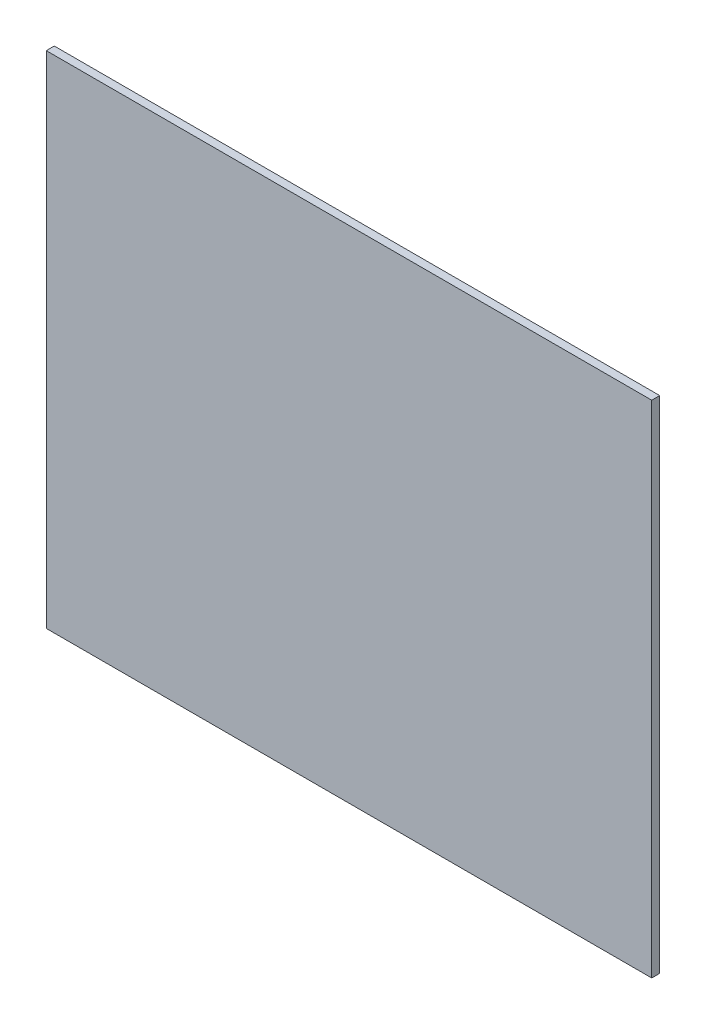
ISO-10303-21;
HEADER;
FILE_DESCRIPTION(('STEP AP214'),'2;1');
FILE_NAME('part.step','',(''),(''),'','','');
FILE_SCHEMA(('AUTOMOTIVE_DESIGN { 1 0 10303 214 1 1 1 1 }'));
ENDSEC;
DATA;
#1=APPLICATION_CONTEXT('core data for automotive mechanical design processes');
#2=APPLICATION_PROTOCOL_DEFINITION('international standard','automotive_design',2000,#1);
#3=PRODUCT_CONTEXT('',#1,'mechanical');
#4=PRODUCT('Part','Part','',(#3));
#5=PRODUCT_RELATED_PRODUCT_CATEGORY('part','',(#4));
#6=PRODUCT_DEFINITION_FORMATION('','',#4);
#7=PRODUCT_DEFINITION_CONTEXT('part definition',#1,'design');
#8=PRODUCT_DEFINITION('design','',#6,#7);
#9=PRODUCT_DEFINITION_SHAPE('','',#8);
#10=(LENGTH_UNIT() NAMED_UNIT(*) SI_UNIT(.MILLI.,.METRE.));
#11=(NAMED_UNIT(*) PLANE_ANGLE_UNIT() SI_UNIT($,.RADIAN.));
#12=(NAMED_UNIT(*) SI_UNIT($,.STERADIAN.) SOLID_ANGLE_UNIT());
#13=UNCERTAINTY_MEASURE_WITH_UNIT(LENGTH_MEASURE(1.E-05),#10,'distance_accuracy_value','');
#14=(GEOMETRIC_REPRESENTATION_CONTEXT(3) GLOBAL_UNCERTAINTY_ASSIGNED_CONTEXT((#13)) GLOBAL_UNIT_ASSIGNED_CONTEXT((#10,
#11,#12)) REPRESENTATION_CONTEXT('',''));
#15=CARTESIAN_POINT('',(0.,0.,0.));
#16=DIRECTION('',(0.,0.,1.));
#17=DIRECTION('',(1.,0.,0.));
#18=AXIS2_PLACEMENT_3D('',#15,#16,#17);
#19=CARTESIAN_POINT('',(-48.7088082243586,16.5000000000001,0.8));
#20=DIRECTION('',(1.,0.,0.));
#21=DIRECTION('',(0.,1.,0.));
#22=AXIS2_PLACEMENT_3D('',#19,#20,#21);
#23=PLANE('',#22);
#24=DIRECTION('',(0.,-1.,0.));
#25=VECTOR('',#24,1.);
#26=CARTESIAN_POINT('',(-48.7088082243586,16.5000000000001,0.));
#27=LINE('',#26,#25);
#28=CARTESIAN_POINT('',(-48.7088082243586,16.5000000000001,0.));
#29=VERTEX_POINT('',#28);
#30=CARTESIAN_POINT('',(-48.7088082243586,-33.4999999999999,0.));
#31=VERTEX_POINT('',#30);
#32=EDGE_CURVE('E96',#29,#31,#27,.T.);
#33=ORIENTED_EDGE('',*,*,#32,.T.);
#34=DIRECTION('',(0.,0.,-1.));
#35=VECTOR('',#34,1.);
#36=CARTESIAN_POINT('',(-48.7088082243586,-33.4999999999999,0.8));
#37=LINE('',#36,#35);
#38=CARTESIAN_POINT('',(-48.7088082243586,-33.4999999999999,0.8));
#39=VERTEX_POINT('',#38);
#40=EDGE_CURVE('E11',#39,#31,#37,.T.);
#41=ORIENTED_EDGE('',*,*,#40,.F.);
#42=DIRECTION('',(0.,-1.,0.));
#43=VECTOR('',#42,1.);
#44=CARTESIAN_POINT('',(-48.7088082243586,16.5000000000001,0.8));
#45=LINE('',#44,#43);
#46=CARTESIAN_POINT('',(-48.7088082243586,16.5000000000001,0.8));
#47=VERTEX_POINT('',#46);
#48=EDGE_CURVE('E84',#47,#39,#45,.T.);
#49=ORIENTED_EDGE('',*,*,#48,.F.);
#50=DIRECTION('',(0.,0.,-1.));
#51=VECTOR('',#50,1.);
#52=CARTESIAN_POINT('',(-48.7088082243586,16.5000000000001,0.8));
#53=LINE('',#52,#51);
#54=EDGE_CURVE('E92',#47,#29,#53,.T.);
#55=ORIENTED_EDGE('',*,*,#54,.T.);
#56=EDGE_LOOP('',(#33,#41,#49,#55));
#57=FACE_BOUND('',#56,.T.);
#58=ADVANCED_FACE('F33',(#57),#23,.F.);
#59=CARTESIAN_POINT('',(-48.7088082243586,-33.4999999999999,0.8));
#60=DIRECTION('',(0.,1.,0.));
#61=DIRECTION('',(0.,0.,1.));
#62=AXIS2_PLACEMENT_3D('',#59,#60,#61);
#63=PLANE('',#62);
#64=DIRECTION('',(1.,0.,0.));
#65=VECTOR('',#64,1.);
#66=CARTESIAN_POINT('',(-48.7088082243586,-33.4999999999999,0.));
#67=LINE('',#66,#65);
#68=CARTESIAN_POINT('',(11.7911917756414,-33.4999999999999,0.));
#69=VERTEX_POINT('',#68);
#70=EDGE_CURVE('E88',#31,#69,#67,.T.);
#71=ORIENTED_EDGE('',*,*,#70,.T.);
#72=DIRECTION('',(0.,0.,-1.));
#73=VECTOR('',#72,1.);
#74=CARTESIAN_POINT('',(11.7911917756414,-33.4999999999999,0.8));
#75=LINE('',#74,#73);
#76=CARTESIAN_POINT('',(11.7911917756414,-33.4999999999999,0.8));
#77=VERTEX_POINT('',#76);
#78=EDGE_CURVE('E41',#77,#69,#75,.T.);
#79=ORIENTED_EDGE('',*,*,#78,.F.);
#80=DIRECTION('',(1.,0.,0.));
#81=VECTOR('',#80,1.);
#82=CARTESIAN_POINT('',(-48.7088082243586,-33.4999999999999,0.8));
#83=LINE('',#82,#81);
#84=EDGE_CURVE('E79',#39,#77,#83,.T.);
#85=ORIENTED_EDGE('',*,*,#84,.F.);
#86=ORIENTED_EDGE('',*,*,#40,.T.);
#87=EDGE_LOOP('',(#71,#79,#85,#86));
#88=FACE_BOUND('',#87,.T.);
#89=ADVANCED_FACE('F87',(#88),#63,.F.);
#90=CARTESIAN_POINT('',(11.7911917756414,16.5000000000001,0.8));
#91=DIRECTION('',(-1.,0.,0.));
#92=DIRECTION('',(0.,-1.,0.));
#93=AXIS2_PLACEMENT_3D('',#90,#91,#92);
#94=PLANE('',#93);
#95=DIRECTION('',(0.,1.,0.));
#96=VECTOR('',#95,1.);
#97=CARTESIAN_POINT('',(11.7911917756414,16.5000000000001,0.));
#98=LINE('',#97,#96);
#99=CARTESIAN_POINT('',(11.7911917756414,16.5000000000001,0.));
#100=VERTEX_POINT('',#99);
#101=EDGE_CURVE('E66',#69,#100,#98,.T.);
#102=ORIENTED_EDGE('',*,*,#101,.T.);
#103=DIRECTION('',(0.,0.,-1.));
#104=VECTOR('',#103,1.);
#105=CARTESIAN_POINT('',(11.7911917756414,16.5000000000001,0.8));
#106=LINE('',#105,#104);
#107=CARTESIAN_POINT('',(11.7911917756414,16.5000000000001,0.8));
#108=VERTEX_POINT('',#107);
#109=EDGE_CURVE('E89',#108,#100,#106,.T.);
#110=ORIENTED_EDGE('',*,*,#109,.F.);
#111=DIRECTION('',(0.,1.,0.));
#112=VECTOR('',#111,1.);
#113=CARTESIAN_POINT('',(11.7911917756414,16.5000000000001,0.8));
#114=LINE('',#113,#112);
#115=EDGE_CURVE('E82',#77,#108,#114,.T.);
#116=ORIENTED_EDGE('',*,*,#115,.F.);
#117=ORIENTED_EDGE('',*,*,#78,.T.);
#118=EDGE_LOOP('',(#102,#110,#116,#117));
#119=FACE_BOUND('',#118,.T.);
#120=ADVANCED_FACE('F90',(#119),#94,.F.);
#121=CARTESIAN_POINT('',(-48.7088082243586,16.5000000000001,0.8));
#122=DIRECTION('',(0.,-1.,0.));
#123=DIRECTION('',(0.,0.,-1.));
#124=AXIS2_PLACEMENT_3D('',#121,#122,#123);
#125=PLANE('',#124);
#126=DIRECTION('',(-1.,0.,0.));
#127=VECTOR('',#126,1.);
#128=CARTESIAN_POINT('',(-48.7088082243586,16.5000000000001,0.));
#129=LINE('',#128,#127);
#130=EDGE_CURVE('E72',#100,#29,#129,.T.);
#131=ORIENTED_EDGE('',*,*,#130,.T.);
#132=ORIENTED_EDGE('',*,*,#54,.F.);
#133=DIRECTION('',(-1.,0.,0.));
#134=VECTOR('',#133,1.);
#135=CARTESIAN_POINT('',(-48.7088082243586,16.5000000000001,0.8));
#136=LINE('',#135,#134);
#137=EDGE_CURVE('E49',#108,#47,#136,.T.);
#138=ORIENTED_EDGE('',*,*,#137,.F.);
#139=ORIENTED_EDGE('',*,*,#109,.T.);
#140=EDGE_LOOP('',(#131,#132,#138,#139));
#141=FACE_BOUND('',#140,.T.);
#142=ADVANCED_FACE('F103',(#141),#125,.F.);
#143=CARTESIAN_POINT('',(0.,0.,0.8));
#144=DIRECTION('',(0.,0.,1.));
#145=DIRECTION('',(1.,0.,0.));
#146=AXIS2_PLACEMENT_3D('',#143,#144,#145);
#147=PLANE('',#146);
#148=ORIENTED_EDGE('',*,*,#48,.T.);
#149=ORIENTED_EDGE('',*,*,#84,.T.);
#150=ORIENTED_EDGE('',*,*,#115,.T.);
#151=ORIENTED_EDGE('',*,*,#137,.T.);
#152=EDGE_LOOP('',(#148,#149,#150,#151));
#153=FACE_BOUND('',#152,.T.);
#154=ADVANCED_FACE('F80',(#153),#147,.T.);
#155=CARTESIAN_POINT('',(0.,0.,0.));
#156=DIRECTION('',(0.,0.,1.));
#157=DIRECTION('',(1.,0.,0.));
#158=AXIS2_PLACEMENT_3D('',#155,#156,#157);
#159=PLANE('',#158);
#160=ORIENTED_EDGE('',*,*,#32,.F.);
#161=ORIENTED_EDGE('',*,*,#130,.F.);
#162=ORIENTED_EDGE('',*,*,#101,.F.);
#163=ORIENTED_EDGE('',*,*,#70,.F.);
#164=EDGE_LOOP('',(#160,#161,#162,#163));
#165=FACE_BOUND('',#164,.T.);
#166=ADVANCED_FACE('F106',(#165),#159,.F.);
#167=CLOSED_SHELL('',(#58,#89,#120,#142,#154,#166));
#168=MANIFOLD_SOLID_BREP('B2',#167);
#169=ADVANCED_BREP_SHAPE_REPRESENTATION('',(#18,#168),#14);
#170=SHAPE_DEFINITION_REPRESENTATION(#9,#169);
ENDSEC;
END-ISO-10303-21;
